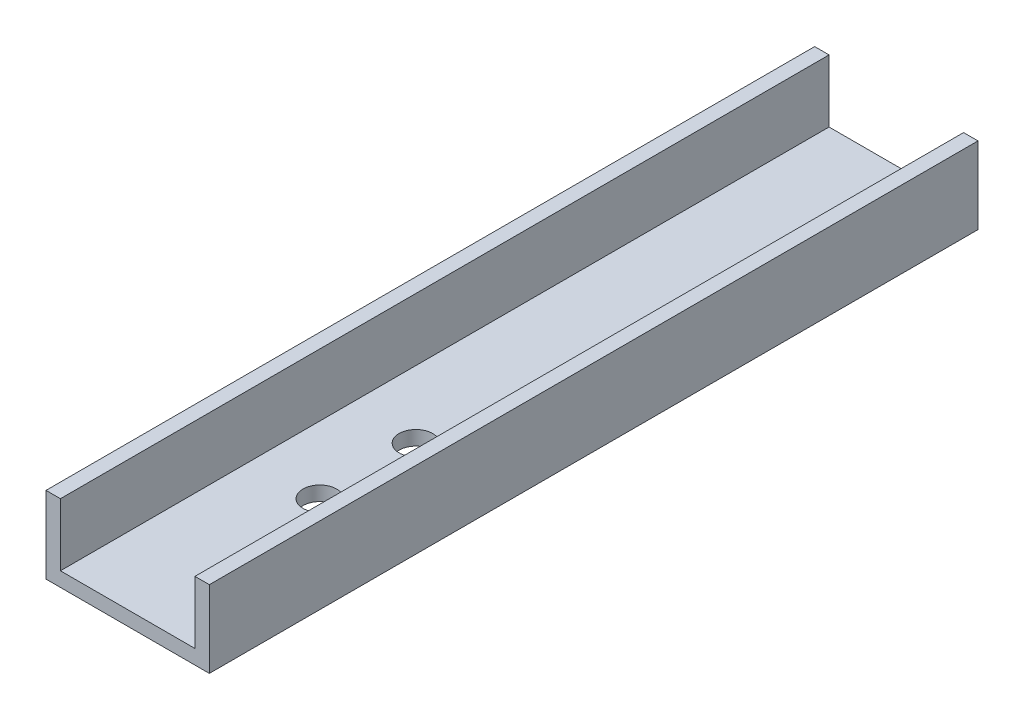
ISO-10303-21;
HEADER;
FILE_DESCRIPTION(('STEP AP214'),'2;1');
FILE_NAME('part.step','',(''),(''),'','','');
FILE_SCHEMA(('AUTOMOTIVE_DESIGN { 1 0 10303 214 1 1 1 1 }'));
ENDSEC;
DATA;
#1=APPLICATION_CONTEXT('core data for automotive mechanical design processes');
#2=APPLICATION_PROTOCOL_DEFINITION('international standard','automotive_design',2000,#1);
#3=PRODUCT_CONTEXT('',#1,'mechanical');
#4=PRODUCT('Part','Part','',(#3));
#5=PRODUCT_RELATED_PRODUCT_CATEGORY('part','',(#4));
#6=PRODUCT_DEFINITION_FORMATION('','',#4);
#7=PRODUCT_DEFINITION_CONTEXT('part definition',#1,'design');
#8=PRODUCT_DEFINITION('design','',#6,#7);
#9=PRODUCT_DEFINITION_SHAPE('','',#8);
#10=(LENGTH_UNIT() NAMED_UNIT(*) SI_UNIT(.MILLI.,.METRE.));
#11=(NAMED_UNIT(*) PLANE_ANGLE_UNIT() SI_UNIT($,.RADIAN.));
#12=(NAMED_UNIT(*) SI_UNIT($,.STERADIAN.) SOLID_ANGLE_UNIT());
#13=UNCERTAINTY_MEASURE_WITH_UNIT(LENGTH_MEASURE(1.E-05),#10,'distance_accuracy_value','');
#14=(GEOMETRIC_REPRESENTATION_CONTEXT(3) GLOBAL_UNCERTAINTY_ASSIGNED_CONTEXT((#13)) GLOBAL_UNIT_ASSIGNED_CONTEXT((#10,
#11,#12)) REPRESENTATION_CONTEXT('',''));
#15=CARTESIAN_POINT('',(0.,0.,0.));
#16=DIRECTION('',(0.,0.,1.));
#17=DIRECTION('',(1.,0.,0.));
#18=AXIS2_PLACEMENT_3D('',#15,#16,#17);
#19=CARTESIAN_POINT('',(0.,0.,80.));
#20=DIRECTION('',(0.,-1.,0.));
#21=DIRECTION('',(1.,0.,0.));
#22=AXIS2_PLACEMENT_3D('',#19,#20,#21);
#23=PLANE('',#22);
#24=CARTESIAN_POINT('',(0.,0.,50.));
#25=DIRECTION('',(0.,-1.,0.));
#26=DIRECTION('',(1.,0.,0.));
#27=AXIS2_PLACEMENT_3D('',#24,#25,#26);
#28=CIRCLE('',#27,1.75);
#29=CARTESIAN_POINT('',(1.75,0.,50.));
#30=VERTEX_POINT('',#29);
#31=EDGE_CURVE('E135',#30,#30,#28,.T.);
#32=ORIENTED_EDGE('',*,*,#31,.T.);
#33=EDGE_LOOP('',(#32));
#34=FACE_BOUND('',#33,.T.);
#35=CARTESIAN_POINT('',(0.,0.,60.));
#36=DIRECTION('',(0.,-1.,0.));
#37=DIRECTION('',(1.,0.,0.));
#38=AXIS2_PLACEMENT_3D('',#35,#36,#37);
#39=CIRCLE('',#38,1.75);
#40=CARTESIAN_POINT('',(1.75,0.,60.));
#41=VERTEX_POINT('',#40);
#42=EDGE_CURVE('E184',#41,#41,#39,.T.);
#43=ORIENTED_EDGE('',*,*,#42,.T.);
#44=EDGE_LOOP('',(#43));
#45=FACE_BOUND('',#44,.T.);
#46=DIRECTION('',(-1.,0.,0.));
#47=VECTOR('',#46,1.);
#48=CARTESIAN_POINT('',(0.,0.,0.));
#49=LINE('',#48,#47);
#50=CARTESIAN_POINT('',(7.,0.,0.));
#51=VERTEX_POINT('',#50);
#52=CARTESIAN_POINT('',(-7.,0.,0.));
#53=VERTEX_POINT('',#52);
#54=EDGE_CURVE('E89',#51,#53,#49,.T.);
#55=ORIENTED_EDGE('',*,*,#54,.T.);
#56=DIRECTION('',(0.,0.,-1.));
#57=VECTOR('',#56,1.);
#58=CARTESIAN_POINT('',(-7.,0.,80.));
#59=LINE('',#58,#57);
#60=CARTESIAN_POINT('',(-7.,0.,80.));
#61=VERTEX_POINT('',#60);
#62=EDGE_CURVE('E11',#61,#53,#59,.T.);
#63=ORIENTED_EDGE('',*,*,#62,.F.);
#64=DIRECTION('',(-1.,0.,0.));
#65=VECTOR('',#64,1.);
#66=CARTESIAN_POINT('',(7.,0.,80.));
#67=LINE('',#66,#65);
#68=CARTESIAN_POINT('',(7.,0.,80.));
#69=VERTEX_POINT('',#68);
#70=EDGE_CURVE('E95',#69,#61,#67,.T.);
#71=ORIENTED_EDGE('',*,*,#70,.F.);
#72=DIRECTION('',(0.,0.,-1.));
#73=VECTOR('',#72,1.);
#74=CARTESIAN_POINT('',(7.,0.,80.));
#75=LINE('',#74,#73);
#76=EDGE_CURVE('E129',#69,#51,#75,.T.);
#77=ORIENTED_EDGE('',*,*,#76,.T.);
#78=EDGE_LOOP('',(#55,#63,#71,#77));
#79=FACE_BOUND('',#78,.T.);
#80=ADVANCED_FACE('F37',(#34,#45,#79),#23,.F.);
#81=CARTESIAN_POINT('',(-7.,0.,80.));
#82=DIRECTION('',(-1.,0.,0.));
#83=DIRECTION('',(0.,0.,1.));
#84=AXIS2_PLACEMENT_3D('',#81,#82,#83);
#85=PLANE('',#84);
#86=DIRECTION('',(0.,1.,0.));
#87=VECTOR('',#86,1.);
#88=CARTESIAN_POINT('',(-7.,0.,0.));
#89=LINE('',#88,#87);
#90=CARTESIAN_POINT('',(-7.,6.5,0.));
#91=VERTEX_POINT('',#90);
#92=EDGE_CURVE('E134',#53,#91,#89,.T.);
#93=ORIENTED_EDGE('',*,*,#92,.T.);
#94=DIRECTION('',(0.,0.,-1.));
#95=VECTOR('',#94,1.);
#96=CARTESIAN_POINT('',(-7.,6.5,80.));
#97=LINE('',#96,#95);
#98=CARTESIAN_POINT('',(-7.,6.5,80.));
#99=VERTEX_POINT('',#98);
#100=EDGE_CURVE('E45',#99,#91,#97,.T.);
#101=ORIENTED_EDGE('',*,*,#100,.F.);
#102=DIRECTION('',(0.,1.,0.));
#103=VECTOR('',#102,1.);
#104=CARTESIAN_POINT('',(-7.,0.,80.));
#105=LINE('',#104,#103);
#106=EDGE_CURVE('E179',#61,#99,#105,.T.);
#107=ORIENTED_EDGE('',*,*,#106,.F.);
#108=ORIENTED_EDGE('',*,*,#62,.T.);
#109=EDGE_LOOP('',(#93,#101,#107,#108));
#110=FACE_BOUND('',#109,.T.);
#111=ADVANCED_FACE('F210',(#110),#85,.F.);
#112=CARTESIAN_POINT('',(-7.,6.5,80.));
#113=DIRECTION('',(0.,-1.,0.));
#114=DIRECTION('',(1.,0.,0.));
#115=AXIS2_PLACEMENT_3D('',#112,#113,#114);
#116=PLANE('',#115);
#117=DIRECTION('',(-1.,0.,0.));
#118=VECTOR('',#117,1.);
#119=CARTESIAN_POINT('',(-7.,6.5,0.));
#120=LINE('',#119,#118);
#121=CARTESIAN_POINT('',(-8.5,6.5,0.));
#122=VERTEX_POINT('',#121);
#123=EDGE_CURVE('E137',#91,#122,#120,.T.);
#124=ORIENTED_EDGE('',*,*,#123,.T.);
#125=DIRECTION('',(0.,0.,-1.));
#126=VECTOR('',#125,1.);
#127=CARTESIAN_POINT('',(-8.5,6.5,80.));
#128=LINE('',#127,#126);
#129=CARTESIAN_POINT('',(-8.5,6.5,80.));
#130=VERTEX_POINT('',#129);
#131=EDGE_CURVE('E154',#130,#122,#128,.T.);
#132=ORIENTED_EDGE('',*,*,#131,.F.);
#133=DIRECTION('',(-1.,0.,0.));
#134=VECTOR('',#133,1.);
#135=CARTESIAN_POINT('',(-7.,6.5,80.));
#136=LINE('',#135,#134);
#137=EDGE_CURVE('E163',#99,#130,#136,.T.);
#138=ORIENTED_EDGE('',*,*,#137,.F.);
#139=ORIENTED_EDGE('',*,*,#100,.T.);
#140=EDGE_LOOP('',(#124,#132,#138,#139));
#141=FACE_BOUND('',#140,.T.);
#142=ADVANCED_FACE('F161',(#141),#116,.F.);
#143=CARTESIAN_POINT('',(-8.5,6.5,80.));
#144=DIRECTION('',(1.,0.,0.));
#145=DIRECTION('',(0.,0.,-1.));
#146=AXIS2_PLACEMENT_3D('',#143,#144,#145);
#147=PLANE('',#146);
#148=DIRECTION('',(0.,-1.,0.));
#149=VECTOR('',#148,1.);
#150=CARTESIAN_POINT('',(-8.5,6.5,0.));
#151=LINE('',#150,#149);
#152=CARTESIAN_POINT('',(-8.5,-1.5,0.));
#153=VERTEX_POINT('',#152);
#154=EDGE_CURVE('E139',#122,#153,#151,.T.);
#155=ORIENTED_EDGE('',*,*,#154,.T.);
#156=DIRECTION('',(0.,0.,-1.));
#157=VECTOR('',#156,1.);
#158=CARTESIAN_POINT('',(-8.5,-1.5,80.));
#159=LINE('',#158,#157);
#160=CARTESIAN_POINT('',(-8.5,-1.5,80.));
#161=VERTEX_POINT('',#160);
#162=EDGE_CURVE('E151',#161,#153,#159,.T.);
#163=ORIENTED_EDGE('',*,*,#162,.F.);
#164=DIRECTION('',(0.,-1.,0.));
#165=VECTOR('',#164,1.);
#166=CARTESIAN_POINT('',(-8.5,6.5,80.));
#167=LINE('',#166,#165);
#168=EDGE_CURVE('E175',#130,#161,#167,.T.);
#169=ORIENTED_EDGE('',*,*,#168,.F.);
#170=ORIENTED_EDGE('',*,*,#131,.T.);
#171=EDGE_LOOP('',(#155,#163,#169,#170));
#172=FACE_BOUND('',#171,.T.);
#173=ADVANCED_FACE('F171',(#172),#147,.F.);
#174=CARTESIAN_POINT('',(-8.5,-1.5,80.));
#175=DIRECTION('',(0.,1.,0.));
#176=DIRECTION('',(0.,0.,1.));
#177=AXIS2_PLACEMENT_3D('',#174,#175,#176);
#178=PLANE('',#177);
#179=CARTESIAN_POINT('',(0.,-1.5,50.));
#180=DIRECTION('',(0.,-1.,0.));
#181=DIRECTION('',(0.,0.,-1.));
#182=AXIS2_PLACEMENT_3D('',#179,#180,#181);
#183=CIRCLE('',#182,1.75);
#184=CARTESIAN_POINT('',(0.,-1.5,48.25));
#185=VERTEX_POINT('',#184);
#186=EDGE_CURVE('E187',#185,#185,#183,.T.);
#187=ORIENTED_EDGE('',*,*,#186,.F.);
#188=EDGE_LOOP('',(#187));
#189=FACE_BOUND('',#188,.T.);
#190=CARTESIAN_POINT('',(0.,-1.5,60.));
#191=DIRECTION('',(0.,-1.,0.));
#192=DIRECTION('',(0.,0.,-1.));
#193=AXIS2_PLACEMENT_3D('',#190,#191,#192);
#194=CIRCLE('',#193,1.75);
#195=CARTESIAN_POINT('',(0.,-1.5,58.25));
#196=VERTEX_POINT('',#195);
#197=EDGE_CURVE('E188',#196,#196,#194,.T.);
#198=ORIENTED_EDGE('',*,*,#197,.F.);
#199=EDGE_LOOP('',(#198));
#200=FACE_BOUND('',#199,.T.);
#201=DIRECTION('',(1.,0.,0.));
#202=VECTOR('',#201,1.);
#203=CARTESIAN_POINT('',(-8.5,-1.5,0.));
#204=LINE('',#203,#202);
#205=CARTESIAN_POINT('',(8.5,-1.5,0.));
#206=VERTEX_POINT('',#205);
#207=EDGE_CURVE('E141',#153,#206,#204,.T.);
#208=ORIENTED_EDGE('',*,*,#207,.T.);
#209=DIRECTION('',(0.,0.,-1.));
#210=VECTOR('',#209,1.);
#211=CARTESIAN_POINT('',(8.5,-1.5,80.));
#212=LINE('',#211,#210);
#213=CARTESIAN_POINT('',(8.5,-1.5,80.));
#214=VERTEX_POINT('',#213);
#215=EDGE_CURVE('E124',#214,#206,#212,.T.);
#216=ORIENTED_EDGE('',*,*,#215,.F.);
#217=DIRECTION('',(1.,0.,0.));
#218=VECTOR('',#217,1.);
#219=CARTESIAN_POINT('',(-8.5,-1.5,80.));
#220=LINE('',#219,#218);
#221=EDGE_CURVE('E115',#161,#214,#220,.T.);
#222=ORIENTED_EDGE('',*,*,#221,.F.);
#223=ORIENTED_EDGE('',*,*,#162,.T.);
#224=EDGE_LOOP('',(#208,#216,#222,#223));
#225=FACE_BOUND('',#224,.T.);
#226=ADVANCED_FACE('F174',(#189,#200,#225),#178,.F.);
#227=CARTESIAN_POINT('',(8.5,-1.5,80.));
#228=DIRECTION('',(-1.,0.,0.));
#229=DIRECTION('',(0.,0.,1.));
#230=AXIS2_PLACEMENT_3D('',#227,#228,#229);
#231=PLANE('',#230);
#232=DIRECTION('',(0.,1.,0.));
#233=VECTOR('',#232,1.);
#234=CARTESIAN_POINT('',(8.5,-1.5,0.));
#235=LINE('',#234,#233);
#236=CARTESIAN_POINT('',(8.5,6.5,0.));
#237=VERTEX_POINT('',#236);
#238=EDGE_CURVE('E123',#206,#237,#235,.T.);
#239=ORIENTED_EDGE('',*,*,#238,.T.);
#240=DIRECTION('',(0.,0.,-1.));
#241=VECTOR('',#240,1.);
#242=CARTESIAN_POINT('',(8.5,6.5,80.));
#243=LINE('',#242,#241);
#244=CARTESIAN_POINT('',(8.5,6.5,80.));
#245=VERTEX_POINT('',#244);
#246=EDGE_CURVE('E120',#245,#237,#243,.T.);
#247=ORIENTED_EDGE('',*,*,#246,.F.);
#248=DIRECTION('',(0.,1.,0.));
#249=VECTOR('',#248,1.);
#250=CARTESIAN_POINT('',(8.5,-1.5,80.));
#251=LINE('',#250,#249);
#252=EDGE_CURVE('E109',#214,#245,#251,.T.);
#253=ORIENTED_EDGE('',*,*,#252,.F.);
#254=ORIENTED_EDGE('',*,*,#215,.T.);
#255=EDGE_LOOP('',(#239,#247,#253,#254));
#256=FACE_BOUND('',#255,.T.);
#257=ADVANCED_FACE('F121',(#256),#231,.F.);
#258=CARTESIAN_POINT('',(8.5,6.5,80.));
#259=DIRECTION('',(0.,-1.,0.));
#260=DIRECTION('',(0.,0.,-1.));
#261=AXIS2_PLACEMENT_3D('',#258,#259,#260);
#262=PLANE('',#261);
#263=DIRECTION('',(-1.,0.,0.));
#264=VECTOR('',#263,1.);
#265=CARTESIAN_POINT('',(8.5,6.5,0.));
#266=LINE('',#265,#264);
#267=CARTESIAN_POINT('',(7.,6.5,0.));
#268=VERTEX_POINT('',#267);
#269=EDGE_CURVE('E82',#237,#268,#266,.T.);
#270=ORIENTED_EDGE('',*,*,#269,.T.);
#271=DIRECTION('',(0.,0.,-1.));
#272=VECTOR('',#271,1.);
#273=CARTESIAN_POINT('',(7.,6.5,80.));
#274=LINE('',#273,#272);
#275=CARTESIAN_POINT('',(7.,6.5,80.));
#276=VERTEX_POINT('',#275);
#277=EDGE_CURVE('E125',#276,#268,#274,.T.);
#278=ORIENTED_EDGE('',*,*,#277,.F.);
#279=DIRECTION('',(-1.,0.,0.));
#280=VECTOR('',#279,1.);
#281=CARTESIAN_POINT('',(8.5,6.5,80.));
#282=LINE('',#281,#280);
#283=EDGE_CURVE('E113',#245,#276,#282,.T.);
#284=ORIENTED_EDGE('',*,*,#283,.F.);
#285=ORIENTED_EDGE('',*,*,#246,.T.);
#286=EDGE_LOOP('',(#270,#278,#284,#285));
#287=FACE_BOUND('',#286,.T.);
#288=ADVANCED_FACE('F127',(#287),#262,.F.);
#289=CARTESIAN_POINT('',(7.,6.5,80.));
#290=DIRECTION('',(1.,0.,0.));
#291=DIRECTION('',(0.,1.,0.));
#292=AXIS2_PLACEMENT_3D('',#289,#290,#291);
#293=PLANE('',#292);
#294=DIRECTION('',(0.,-1.,0.));
#295=VECTOR('',#294,1.);
#296=CARTESIAN_POINT('',(7.,6.5,0.));
#297=LINE('',#296,#295);
#298=EDGE_CURVE('E145',#268,#51,#297,.T.);
#299=ORIENTED_EDGE('',*,*,#298,.T.);
#300=ORIENTED_EDGE('',*,*,#76,.F.);
#301=DIRECTION('',(0.,-1.,0.));
#302=VECTOR('',#301,1.);
#303=CARTESIAN_POINT('',(7.,6.5,80.));
#304=LINE('',#303,#302);
#305=EDGE_CURVE('E53',#276,#69,#304,.T.);
#306=ORIENTED_EDGE('',*,*,#305,.F.);
#307=ORIENTED_EDGE('',*,*,#277,.T.);
#308=EDGE_LOOP('',(#299,#300,#306,#307));
#309=FACE_BOUND('',#308,.T.);
#310=ADVANCED_FACE('F224',(#309),#293,.F.);
#311=CARTESIAN_POINT('',(0.,0.,80.));
#312=DIRECTION('',(0.,0.,-1.));
#313=DIRECTION('',(-1.,0.,0.));
#314=AXIS2_PLACEMENT_3D('',#311,#312,#313);
#315=PLANE('',#314);
#316=ORIENTED_EDGE('',*,*,#70,.T.);
#317=ORIENTED_EDGE('',*,*,#106,.T.);
#318=ORIENTED_EDGE('',*,*,#137,.T.);
#319=ORIENTED_EDGE('',*,*,#168,.T.);
#320=ORIENTED_EDGE('',*,*,#221,.T.);
#321=ORIENTED_EDGE('',*,*,#252,.T.);
#322=ORIENTED_EDGE('',*,*,#283,.T.);
#323=ORIENTED_EDGE('',*,*,#305,.T.);
#324=EDGE_LOOP('',(#316,#317,#318,#319,#320,#321,#322,#323));
#325=FACE_BOUND('',#324,.T.);
#326=ADVANCED_FACE('F111',(#325),#315,.F.);
#327=CARTESIAN_POINT('',(0.,0.,0.));
#328=DIRECTION('',(0.,0.,-1.));
#329=DIRECTION('',(-1.,0.,0.));
#330=AXIS2_PLACEMENT_3D('',#327,#328,#329);
#331=PLANE('',#330);
#332=ORIENTED_EDGE('',*,*,#54,.F.);
#333=ORIENTED_EDGE('',*,*,#298,.F.);
#334=ORIENTED_EDGE('',*,*,#269,.F.);
#335=ORIENTED_EDGE('',*,*,#238,.F.);
#336=ORIENTED_EDGE('',*,*,#207,.F.);
#337=ORIENTED_EDGE('',*,*,#154,.F.);
#338=ORIENTED_EDGE('',*,*,#123,.F.);
#339=ORIENTED_EDGE('',*,*,#92,.F.);
#340=EDGE_LOOP('',(#332,#333,#334,#335,#336,#337,#338,#339));
#341=FACE_BOUND('',#340,.T.);
#342=ADVANCED_FACE('F167',(#341),#331,.T.);
#343=CARTESIAN_POINT('',(0.,6.5,60.));
#344=DIRECTION('',(0.,-1.,0.));
#345=DIRECTION('',(0.,0.,-1.));
#346=AXIS2_PLACEMENT_3D('',#343,#344,#345);
#347=CYLINDRICAL_SURFACE('',#346,1.75);
#348=ORIENTED_EDGE('',*,*,#197,.T.);
#349=EDGE_LOOP('',(#348));
#350=FACE_BOUND('',#349,.T.);
#351=ORIENTED_EDGE('',*,*,#42,.F.);
#352=EDGE_LOOP('',(#351));
#353=FACE_BOUND('',#352,.T.);
#354=ADVANCED_FACE('F202',(#350,#353),#347,.F.);
#355=CARTESIAN_POINT('',(0.,6.5,50.));
#356=DIRECTION('',(0.,-1.,0.));
#357=DIRECTION('',(0.,0.,-1.));
#358=AXIS2_PLACEMENT_3D('',#355,#356,#357);
#359=CYLINDRICAL_SURFACE('',#358,1.75);
#360=ORIENTED_EDGE('',*,*,#186,.T.);
#361=EDGE_LOOP('',(#360));
#362=FACE_BOUND('',#361,.T.);
#363=ORIENTED_EDGE('',*,*,#31,.F.);
#364=EDGE_LOOP('',(#363));
#365=FACE_BOUND('',#364,.T.);
#366=ADVANCED_FACE('F194',(#362,#365),#359,.F.);
#367=CLOSED_SHELL('',(#80,#111,#142,#173,#226,#257,#288,#310,#326,#342,#354,#366));
#368=MANIFOLD_SOLID_BREP('B2',#367);
#369=ADVANCED_BREP_SHAPE_REPRESENTATION('',(#18,#368),#14);
#370=SHAPE_DEFINITION_REPRESENTATION(#9,#369);
ENDSEC;
END-ISO-10303-21;
